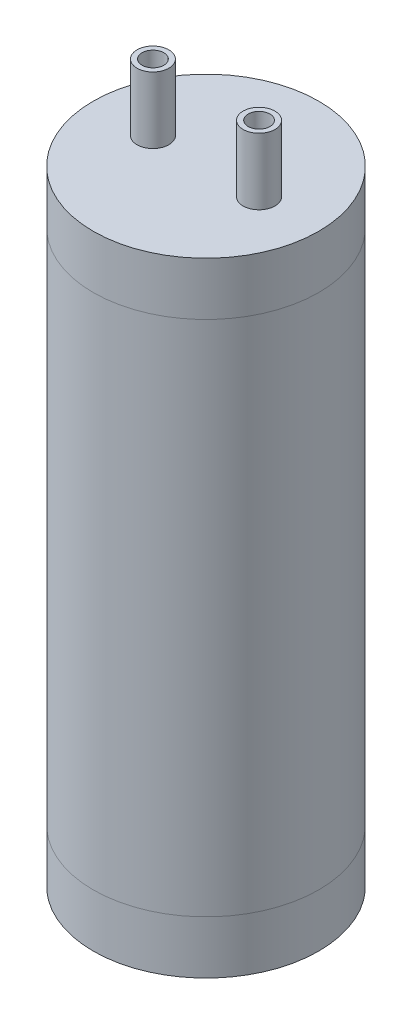
ISO-10303-21;
HEADER;
FILE_DESCRIPTION(('STEP AP214'),'2;1');
FILE_NAME('part.step','',(''),(''),'','','');
FILE_SCHEMA(('AUTOMOTIVE_DESIGN { 1 0 10303 214 1 1 1 1 }'));
ENDSEC;
DATA;
#1=APPLICATION_CONTEXT('core data for automotive mechanical design processes');
#2=APPLICATION_PROTOCOL_DEFINITION('international standard','automotive_design',2000,#1);
#3=PRODUCT_CONTEXT('',#1,'mechanical');
#4=PRODUCT('Part','Part','',(#3));
#5=PRODUCT_RELATED_PRODUCT_CATEGORY('part','',(#4));
#6=PRODUCT_DEFINITION_FORMATION('','',#4);
#7=PRODUCT_DEFINITION_CONTEXT('part definition',#1,'design');
#8=PRODUCT_DEFINITION('design','',#6,#7);
#9=PRODUCT_DEFINITION_SHAPE('','',#8);
#10=(LENGTH_UNIT() NAMED_UNIT(*) SI_UNIT(.MILLI.,.METRE.));
#11=(NAMED_UNIT(*) PLANE_ANGLE_UNIT() SI_UNIT($,.RADIAN.));
#12=(NAMED_UNIT(*) SI_UNIT($,.STERADIAN.) SOLID_ANGLE_UNIT());
#13=UNCERTAINTY_MEASURE_WITH_UNIT(LENGTH_MEASURE(1.E-05),#10,'distance_accuracy_value','');
#14=(GEOMETRIC_REPRESENTATION_CONTEXT(3) GLOBAL_UNCERTAINTY_ASSIGNED_CONTEXT((#13)) GLOBAL_UNIT_ASSIGNED_CONTEXT((#10,
#11,#12)) REPRESENTATION_CONTEXT('',''));
#15=CARTESIAN_POINT('',(0.,0.,0.));
#16=DIRECTION('',(0.,0.,1.));
#17=DIRECTION('',(1.,0.,0.));
#18=AXIS2_PLACEMENT_3D('',#15,#16,#17);
#19=CARTESIAN_POINT('',(20.,260.,0.));
#20=DIRECTION('',(0.,1.,0.));
#21=DIRECTION('',(0.,0.,1.));
#22=AXIS2_PLACEMENT_3D('',#19,#20,#21);
#23=PLANE('',#22);
#24=CARTESIAN_POINT('',(20.,260.,0.));
#25=DIRECTION('',(0.,1.,0.));
#26=DIRECTION('',(0.,0.,1.));
#27=AXIS2_PLACEMENT_3D('',#24,#25,#26);
#28=CIRCLE('',#27,6.);
#29=CARTESIAN_POINT('',(20.,260.,6.));
#30=VERTEX_POINT('',#29);
#31=EDGE_CURVE('E11',#30,#30,#28,.T.);
#32=ORIENTED_EDGE('',*,*,#31,.T.);
#33=EDGE_LOOP('',(#32));
#34=FACE_BOUND('',#33,.T.);
#35=CARTESIAN_POINT('',(20.,260.,0.));
#36=DIRECTION('',(0.,1.,0.));
#37=DIRECTION('',(0.,0.,1.));
#38=AXIS2_PLACEMENT_3D('',#35,#36,#37);
#39=CIRCLE('',#38,4.1);
#40=CARTESIAN_POINT('',(20.,260.,4.1));
#41=VERTEX_POINT('',#40);
#42=EDGE_CURVE('E61',#41,#41,#39,.T.);
#43=ORIENTED_EDGE('',*,*,#42,.F.);
#44=EDGE_LOOP('',(#43));
#45=FACE_BOUND('',#44,.T.);
#46=ADVANCED_FACE('F49',(#34,#45),#23,.T.);
#47=CARTESIAN_POINT('',(20.,235.,0.));
#48=DIRECTION('',(0.,1.,0.));
#49=DIRECTION('',(0.,0.,1.));
#50=AXIS2_PLACEMENT_3D('',#47,#48,#49);
#51=PLANE('',#50);
#52=CARTESIAN_POINT('',(20.,235.,0.));
#53=DIRECTION('',(0.,1.,0.));
#54=DIRECTION('',(0.,0.,1.));
#55=AXIS2_PLACEMENT_3D('',#52,#53,#54);
#56=CIRCLE('',#55,6.);
#57=CARTESIAN_POINT('',(20.,235.,6.));
#58=VERTEX_POINT('',#57);
#59=EDGE_CURVE('E53',#58,#58,#56,.T.);
#60=ORIENTED_EDGE('',*,*,#59,.F.);
#61=EDGE_LOOP('',(#60));
#62=FACE_BOUND('',#61,.T.);
#63=CARTESIAN_POINT('',(20.,235.,0.));
#64=DIRECTION('',(0.,1.,0.));
#65=DIRECTION('',(0.,0.,1.));
#66=AXIS2_PLACEMENT_3D('',#63,#64,#65);
#67=CIRCLE('',#66,4.1);
#68=CARTESIAN_POINT('',(20.,235.,4.1));
#69=VERTEX_POINT('',#68);
#70=EDGE_CURVE('E69',#69,#69,#67,.T.);
#71=ORIENTED_EDGE('',*,*,#70,.T.);
#72=EDGE_LOOP('',(#71));
#73=FACE_BOUND('',#72,.T.);
#74=ADVANCED_FACE('F80',(#62,#73),#51,.F.);
#75=CARTESIAN_POINT('',(20.,260.,0.));
#76=DIRECTION('',(0.,-1.,0.));
#77=DIRECTION('',(0.,0.,-1.));
#78=AXIS2_PLACEMENT_3D('',#75,#76,#77);
#79=CYLINDRICAL_SURFACE('',#78,6.);
#80=ORIENTED_EDGE('',*,*,#31,.F.);
#81=EDGE_LOOP('',(#80));
#82=FACE_BOUND('',#81,.T.);
#83=ORIENTED_EDGE('',*,*,#59,.T.);
#84=EDGE_LOOP('',(#83));
#85=FACE_BOUND('',#84,.T.);
#86=ADVANCED_FACE('F55',(#82,#85),#79,.T.);
#87=CARTESIAN_POINT('',(20.,260.,0.));
#88=DIRECTION('',(0.,-1.,0.));
#89=DIRECTION('',(0.,0.,-1.));
#90=AXIS2_PLACEMENT_3D('',#87,#88,#89);
#91=CYLINDRICAL_SURFACE('',#90,4.1);
#92=ORIENTED_EDGE('',*,*,#42,.T.);
#93=EDGE_LOOP('',(#92));
#94=FACE_BOUND('',#93,.T.);
#95=ORIENTED_EDGE('',*,*,#70,.F.);
#96=EDGE_LOOP('',(#95));
#97=FACE_BOUND('',#96,.T.);
#98=ADVANCED_FACE('F72',(#94,#97),#91,.F.);
#99=CLOSED_SHELL('',(#46,#74,#86,#98));
#100=MANIFOLD_SOLID_BREP('B2',#99);
#101=CARTESIAN_POINT('',(-20.,260.,0.));
#102=DIRECTION('',(0.,1.,0.));
#103=DIRECTION('',(0.,0.,1.));
#104=AXIS2_PLACEMENT_3D('',#101,#102,#103);
#105=PLANE('',#104);
#106=CARTESIAN_POINT('',(-20.,260.,0.));
#107=DIRECTION('',(0.,1.,0.));
#108=DIRECTION('',(0.,0.,1.));
#109=AXIS2_PLACEMENT_3D('',#106,#107,#108);
#110=CIRCLE('',#109,6.);
#111=CARTESIAN_POINT('',(-20.,260.,6.));
#112=VERTEX_POINT('',#111);
#113=EDGE_CURVE('E47',#112,#112,#110,.T.);
#114=ORIENTED_EDGE('',*,*,#113,.T.);
#115=EDGE_LOOP('',(#114));
#116=FACE_BOUND('',#115,.T.);
#117=CARTESIAN_POINT('',(-20.,260.,0.));
#118=DIRECTION('',(0.,1.,0.));
#119=DIRECTION('',(0.,0.,1.));
#120=AXIS2_PLACEMENT_3D('',#117,#118,#119);
#121=CIRCLE('',#120,4.1);
#122=CARTESIAN_POINT('',(-20.,260.,4.1));
#123=VERTEX_POINT('',#122);
#124=EDGE_CURVE('E145',#123,#123,#121,.T.);
#125=ORIENTED_EDGE('',*,*,#124,.F.);
#126=EDGE_LOOP('',(#125));
#127=FACE_BOUND('',#126,.T.);
#128=ADVANCED_FACE('F129',(#116,#127),#105,.T.);
#129=CARTESIAN_POINT('',(-20.,235.,0.));
#130=DIRECTION('',(0.,1.,0.));
#131=DIRECTION('',(0.,0.,1.));
#132=AXIS2_PLACEMENT_3D('',#129,#130,#131);
#133=PLANE('',#132);
#134=CARTESIAN_POINT('',(-20.,235.,0.));
#135=DIRECTION('',(0.,1.,0.));
#136=DIRECTION('',(0.,0.,1.));
#137=AXIS2_PLACEMENT_3D('',#134,#135,#136);
#138=CIRCLE('',#137,6.);
#139=CARTESIAN_POINT('',(-20.,235.,6.));
#140=VERTEX_POINT('',#139);
#141=EDGE_CURVE('E131',#140,#140,#138,.T.);
#142=ORIENTED_EDGE('',*,*,#141,.F.);
#143=EDGE_LOOP('',(#142));
#144=FACE_BOUND('',#143,.T.);
#145=CARTESIAN_POINT('',(-20.,235.,0.));
#146=DIRECTION('',(0.,1.,0.));
#147=DIRECTION('',(0.,0.,1.));
#148=AXIS2_PLACEMENT_3D('',#145,#146,#147);
#149=CIRCLE('',#148,4.1);
#150=CARTESIAN_POINT('',(-20.,235.,4.1));
#151=VERTEX_POINT('',#150);
#152=EDGE_CURVE('E144',#151,#151,#149,.T.);
#153=ORIENTED_EDGE('',*,*,#152,.T.);
#154=EDGE_LOOP('',(#153));
#155=FACE_BOUND('',#154,.T.);
#156=ADVANCED_FACE('F152',(#144,#155),#133,.F.);
#157=CARTESIAN_POINT('',(-20.,260.,0.));
#158=DIRECTION('',(0.,-1.,0.));
#159=DIRECTION('',(0.,0.,-1.));
#160=AXIS2_PLACEMENT_3D('',#157,#158,#159);
#161=CYLINDRICAL_SURFACE('',#160,6.);
#162=ORIENTED_EDGE('',*,*,#113,.F.);
#163=EDGE_LOOP('',(#162));
#164=FACE_BOUND('',#163,.T.);
#165=ORIENTED_EDGE('',*,*,#141,.T.);
#166=EDGE_LOOP('',(#165));
#167=FACE_BOUND('',#166,.T.);
#168=ADVANCED_FACE('F128',(#164,#167),#161,.T.);
#169=CARTESIAN_POINT('',(-20.,260.,0.));
#170=DIRECTION('',(0.,-1.,0.));
#171=DIRECTION('',(0.,0.,-1.));
#172=AXIS2_PLACEMENT_3D('',#169,#170,#171);
#173=CYLINDRICAL_SURFACE('',#172,4.1);
#174=ORIENTED_EDGE('',*,*,#124,.T.);
#175=EDGE_LOOP('',(#174));
#176=FACE_BOUND('',#175,.T.);
#177=ORIENTED_EDGE('',*,*,#152,.F.);
#178=EDGE_LOOP('',(#177));
#179=FACE_BOUND('',#178,.T.);
#180=ADVANCED_FACE('F154',(#176,#179),#173,.F.);
#181=CLOSED_SHELL('',(#128,#156,#168,#180));
#182=MANIFOLD_SOLID_BREP('B6',#181);
#183=CARTESIAN_POINT('',(0.,-8.,0.));
#184=DIRECTION('',(0.,1.,0.));
#185=DIRECTION('',(0.,0.,1.));
#186=AXIS2_PLACEMENT_3D('',#183,#184,#185);
#187=CYLINDRICAL_SURFACE('',#186,4.);
#188=CARTESIAN_POINT('',(0.,-8.,0.));
#189=DIRECTION('',(0.,1.,0.));
#190=DIRECTION('',(0.,0.,1.));
#191=AXIS2_PLACEMENT_3D('',#188,#189,#190);
#192=CIRCLE('',#191,4.);
#193=CARTESIAN_POINT('',(0.,-8.,4.));
#194=VERTEX_POINT('',#193);
#195=EDGE_CURVE('E130',#194,#194,#192,.T.);
#196=ORIENTED_EDGE('',*,*,#195,.T.);
#197=EDGE_LOOP('',(#196));
#198=FACE_BOUND('',#197,.T.);
#199=CARTESIAN_POINT('',(0.,0.,0.));
#200=DIRECTION('',(0.,1.,0.));
#201=DIRECTION('',(0.,0.,1.));
#202=AXIS2_PLACEMENT_3D('',#199,#200,#201);
#203=CIRCLE('',#202,4.);
#204=CARTESIAN_POINT('',(0.,0.,4.));
#205=VERTEX_POINT('',#204);
#206=EDGE_CURVE('E209',#205,#205,#203,.T.);
#207=ORIENTED_EDGE('',*,*,#206,.F.);
#208=EDGE_LOOP('',(#207));
#209=FACE_BOUND('',#208,.T.);
#210=ADVANCED_FACE('F207',(#198,#209),#187,.T.);
#211=CARTESIAN_POINT('',(0.,-8.,0.));
#212=DIRECTION('',(0.,1.,0.));
#213=DIRECTION('',(0.,0.,1.));
#214=AXIS2_PLACEMENT_3D('',#211,#212,#213);
#215=PLANE('',#214);
#216=ORIENTED_EDGE('',*,*,#195,.F.);
#217=EDGE_LOOP('',(#216));
#218=FACE_BOUND('',#217,.T.);
#219=ADVANCED_FACE('F222',(#218),#215,.F.);
#220=CARTESIAN_POINT('',(0.,0.,0.));
#221=DIRECTION('',(0.,1.,0.));
#222=DIRECTION('',(0.,0.,1.));
#223=AXIS2_PLACEMENT_3D('',#220,#221,#222);
#224=PLANE('',#223);
#225=ORIENTED_EDGE('',*,*,#206,.T.);
#226=EDGE_LOOP('',(#225));
#227=FACE_BOUND('',#226,.T.);
#228=ADVANCED_FACE('F217',(#227),#224,.T.);
#229=CLOSED_SHELL('',(#210,#219,#228));
#230=MANIFOLD_SOLID_BREP('B42',#229);
#231=CARTESIAN_POINT('',(0.,235.,0.));
#232=DIRECTION('',(0.,-1.,0.));
#233=DIRECTION('',(0.,0.,-1.));
#234=AXIS2_PLACEMENT_3D('',#231,#232,#233);
#235=CYLINDRICAL_SURFACE('',#234,42.5);
#236=CARTESIAN_POINT('',(0.,235.,0.));
#237=DIRECTION('',(0.,1.,0.));
#238=DIRECTION('',(0.,0.,1.));
#239=AXIS2_PLACEMENT_3D('',#236,#237,#238);
#240=CIRCLE('',#239,42.5);
#241=CARTESIAN_POINT('',(0.,235.,42.5));
#242=VERTEX_POINT('',#241);
#243=EDGE_CURVE('E204',#242,#242,#240,.T.);
#244=ORIENTED_EDGE('',*,*,#243,.F.);
#245=EDGE_LOOP('',(#244));
#246=FACE_BOUND('',#245,.T.);
#247=CARTESIAN_POINT('',(0.,215.,0.));
#248=DIRECTION('',(0.,1.,0.));
#249=DIRECTION('',(0.,0.,1.));
#250=AXIS2_PLACEMENT_3D('',#247,#248,#249);
#251=CIRCLE('',#250,42.5);
#252=CARTESIAN_POINT('',(0.,215.,42.5));
#253=VERTEX_POINT('',#252);
#254=EDGE_CURVE('E265',#253,#253,#251,.T.);
#255=ORIENTED_EDGE('',*,*,#254,.T.);
#256=EDGE_LOOP('',(#255));
#257=FACE_BOUND('',#256,.T.);
#258=ADVANCED_FACE('F258',(#246,#257),#235,.T.);
#259=CARTESIAN_POINT('',(0.,235.,0.));
#260=DIRECTION('',(0.,1.,0.));
#261=DIRECTION('',(0.,0.,1.));
#262=AXIS2_PLACEMENT_3D('',#259,#260,#261);
#263=PLANE('',#262);
#264=ORIENTED_EDGE('',*,*,#243,.T.);
#265=EDGE_LOOP('',(#264));
#266=FACE_BOUND('',#265,.T.);
#267=ADVANCED_FACE('F280',(#266),#263,.T.);
#268=CARTESIAN_POINT('',(0.,215.,0.));
#269=DIRECTION('',(0.,1.,0.));
#270=DIRECTION('',(0.,0.,1.));
#271=AXIS2_PLACEMENT_3D('',#268,#269,#270);
#272=PLANE('',#271);
#273=ORIENTED_EDGE('',*,*,#254,.F.);
#274=EDGE_LOOP('',(#273));
#275=FACE_BOUND('',#274,.T.);
#276=ADVANCED_FACE('F273',(#275),#272,.F.);
#277=CLOSED_SHELL('',(#258,#267,#276));
#278=MANIFOLD_SOLID_BREP('B125',#277);
#279=CARTESIAN_POINT('',(0.,0.,0.));
#280=DIRECTION('',(0.,1.,0.));
#281=DIRECTION('',(0.,0.,1.));
#282=AXIS2_PLACEMENT_3D('',#279,#280,#281);
#283=CYLINDRICAL_SURFACE('',#282,42.5);
#284=CARTESIAN_POINT('',(0.,0.,0.));
#285=DIRECTION('',(0.,1.,0.));
#286=DIRECTION('',(0.,0.,1.));
#287=AXIS2_PLACEMENT_3D('',#284,#285,#286);
#288=CIRCLE('',#287,42.5);
#289=CARTESIAN_POINT('',(0.,0.,42.5));
#290=VERTEX_POINT('',#289);
#291=EDGE_CURVE('E256',#290,#290,#288,.T.);
#292=ORIENTED_EDGE('',*,*,#291,.T.);
#293=EDGE_LOOP('',(#292));
#294=FACE_BOUND('',#293,.T.);
#295=CARTESIAN_POINT('',(0.,20.,0.));
#296=DIRECTION('',(0.,1.,0.));
#297=DIRECTION('',(0.,0.,1.));
#298=AXIS2_PLACEMENT_3D('',#295,#296,#297);
#299=CIRCLE('',#298,42.5);
#300=CARTESIAN_POINT('',(0.,20.,42.5));
#301=VERTEX_POINT('',#300);
#302=EDGE_CURVE('E317',#301,#301,#299,.T.);
#303=ORIENTED_EDGE('',*,*,#302,.F.);
#304=EDGE_LOOP('',(#303));
#305=FACE_BOUND('',#304,.T.);
#306=ADVANCED_FACE('F312',(#294,#305),#283,.T.);
#307=CARTESIAN_POINT('',(0.,0.,0.));
#308=DIRECTION('',(0.,1.,0.));
#309=DIRECTION('',(0.,0.,1.));
#310=AXIS2_PLACEMENT_3D('',#307,#308,#309);
#311=PLANE('',#310);
#312=ORIENTED_EDGE('',*,*,#291,.F.);
#313=EDGE_LOOP('',(#312));
#314=FACE_BOUND('',#313,.T.);
#315=ADVANCED_FACE('F327',(#314),#311,.F.);
#316=CARTESIAN_POINT('',(0.,20.,0.));
#317=DIRECTION('',(0.,1.,0.));
#318=DIRECTION('',(0.,0.,1.));
#319=AXIS2_PLACEMENT_3D('',#316,#317,#318);
#320=PLANE('',#319);
#321=ORIENTED_EDGE('',*,*,#302,.T.);
#322=EDGE_LOOP('',(#321));
#323=FACE_BOUND('',#322,.T.);
#324=ADVANCED_FACE('F326',(#323),#320,.T.);
#325=CLOSED_SHELL('',(#306,#315,#324));
#326=MANIFOLD_SOLID_BREP('B197',#325);
#327=CARTESIAN_POINT('',(0.,215.,0.));
#328=DIRECTION('',(0.,-1.,0.));
#329=DIRECTION('',(0.,0.,-1.));
#330=AXIS2_PLACEMENT_3D('',#327,#328,#329);
#331=CYLINDRICAL_SURFACE('',#330,42.5);
#332=CARTESIAN_POINT('',(0.,215.,0.));
#333=DIRECTION('',(0.,1.,0.));
#334=DIRECTION('',(0.,0.,1.));
#335=AXIS2_PLACEMENT_3D('',#332,#333,#334);
#336=CIRCLE('',#335,42.5);
#337=CARTESIAN_POINT('',(0.,215.,42.5));
#338=VERTEX_POINT('',#337);
#339=EDGE_CURVE('E315',#338,#338,#336,.T.);
#340=ORIENTED_EDGE('',*,*,#339,.F.);
#341=EDGE_LOOP('',(#340));
#342=FACE_BOUND('',#341,.T.);
#343=CARTESIAN_POINT('',(0.,20.,0.));
#344=DIRECTION('',(0.,1.,0.));
#345=DIRECTION('',(0.,0.,1.));
#346=AXIS2_PLACEMENT_3D('',#343,#344,#345);
#347=CIRCLE('',#346,42.5);
#348=CARTESIAN_POINT('',(0.,20.,42.5));
#349=VERTEX_POINT('',#348);
#350=EDGE_CURVE('E365',#349,#349,#347,.T.);
#351=ORIENTED_EDGE('',*,*,#350,.T.);
#352=EDGE_LOOP('',(#351));
#353=FACE_BOUND('',#352,.T.);
#354=ADVANCED_FACE('F360',(#342,#353),#331,.T.);
#355=CARTESIAN_POINT('',(0.,215.,0.));
#356=DIRECTION('',(0.,1.,0.));
#357=DIRECTION('',(0.,0.,1.));
#358=AXIS2_PLACEMENT_3D('',#355,#356,#357);
#359=PLANE('',#358);
#360=ORIENTED_EDGE('',*,*,#339,.T.);
#361=EDGE_LOOP('',(#360));
#362=FACE_BOUND('',#361,.T.);
#363=ADVANCED_FACE('F376',(#362),#359,.T.);
#364=CARTESIAN_POINT('',(0.,20.,0.));
#365=DIRECTION('',(0.,1.,0.));
#366=DIRECTION('',(0.,0.,1.));
#367=AXIS2_PLACEMENT_3D('',#364,#365,#366);
#368=PLANE('',#367);
#369=ORIENTED_EDGE('',*,*,#350,.F.);
#370=EDGE_LOOP('',(#369));
#371=FACE_BOUND('',#370,.T.);
#372=ADVANCED_FACE('F372',(#371),#368,.F.);
#373=CLOSED_SHELL('',(#354,#363,#372));
#374=MANIFOLD_SOLID_BREP('B251',#373);
#375=ADVANCED_BREP_SHAPE_REPRESENTATION('',(#18,#100,#182,#230,#278,#326,#374),#14);
#376=SHAPE_DEFINITION_REPRESENTATION(#9,#375);
ENDSEC;
END-ISO-10303-21;
